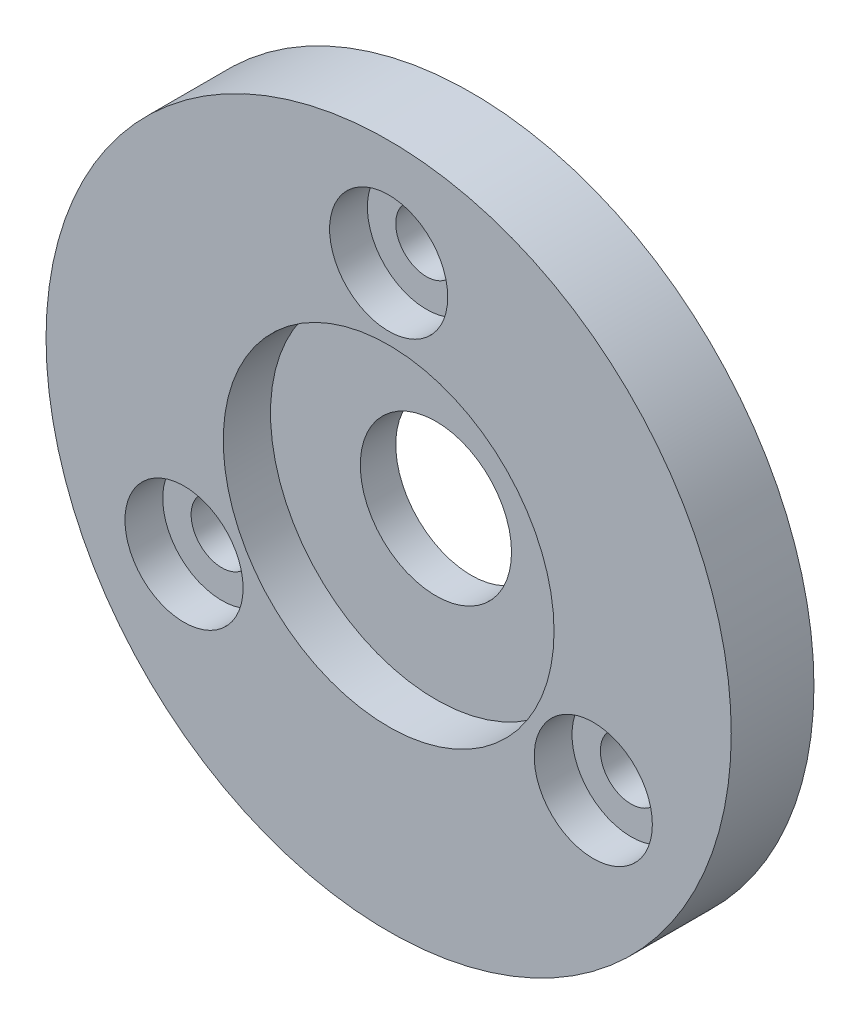
ISO-10303-21;
HEADER;
FILE_DESCRIPTION(('STEP AP214'),'2;1');
FILE_NAME('part.step','',(''),(''),'','','');
FILE_SCHEMA(('AUTOMOTIVE_DESIGN { 1 0 10303 214 1 1 1 1 }'));
ENDSEC;
DATA;
#1=APPLICATION_CONTEXT('core data for automotive mechanical design processes');
#2=APPLICATION_PROTOCOL_DEFINITION('international standard','automotive_design',2000,#1);
#3=PRODUCT_CONTEXT('',#1,'mechanical');
#4=PRODUCT('Part','Part','',(#3));
#5=PRODUCT_RELATED_PRODUCT_CATEGORY('part','',(#4));
#6=PRODUCT_DEFINITION_FORMATION('','',#4);
#7=PRODUCT_DEFINITION_CONTEXT('part definition',#1,'design');
#8=PRODUCT_DEFINITION('design','',#6,#7);
#9=PRODUCT_DEFINITION_SHAPE('','',#8);
#10=(LENGTH_UNIT() NAMED_UNIT(*) SI_UNIT(.MILLI.,.METRE.));
#11=(NAMED_UNIT(*) PLANE_ANGLE_UNIT() SI_UNIT($,.RADIAN.));
#12=(NAMED_UNIT(*) SI_UNIT($,.STERADIAN.) SOLID_ANGLE_UNIT());
#13=UNCERTAINTY_MEASURE_WITH_UNIT(LENGTH_MEASURE(1.E-05),#10,'distance_accuracy_value','');
#14=(GEOMETRIC_REPRESENTATION_CONTEXT(3) GLOBAL_UNCERTAINTY_ASSIGNED_CONTEXT((#13)) GLOBAL_UNIT_ASSIGNED_CONTEXT((#10,
#11,#12)) REPRESENTATION_CONTEXT('',''));
#15=CARTESIAN_POINT('',(0.,0.,0.));
#16=DIRECTION('',(0.,0.,1.));
#17=DIRECTION('',(1.,0.,0.));
#18=AXIS2_PLACEMENT_3D('',#15,#16,#17);
#19=CARTESIAN_POINT('',(0.,0.,0.));
#20=DIRECTION('',(0.,0.,1.));
#21=DIRECTION('',(1.,0.,0.));
#22=AXIS2_PLACEMENT_3D('',#19,#20,#21);
#23=CYLINDRICAL_SURFACE('',#22,3.2);
#24=CARTESIAN_POINT('',(0.,0.,0.));
#25=DIRECTION('',(0.,0.,1.));
#26=DIRECTION('',(1.,0.,0.));
#27=AXIS2_PLACEMENT_3D('',#24,#25,#26);
#28=CIRCLE('',#27,3.2);
#29=CARTESIAN_POINT('',(3.2,0.,0.));
#30=VERTEX_POINT('',#29);
#31=EDGE_CURVE('E44',#30,#30,#28,.T.);
#32=ORIENTED_EDGE('',*,*,#31,.F.);
#33=EDGE_LOOP('',(#32));
#34=FACE_BOUND('',#33,.T.);
#35=CARTESIAN_POINT('',(0.,0.,1.5));
#36=DIRECTION('',(0.,0.,1.));
#37=DIRECTION('',(1.,0.,0.));
#38=AXIS2_PLACEMENT_3D('',#35,#36,#37);
#39=CIRCLE('',#38,3.2);
#40=CARTESIAN_POINT('',(3.2,0.,1.5));
#41=VERTEX_POINT('',#40);
#42=EDGE_CURVE('E35',#41,#41,#39,.F.);
#43=ORIENTED_EDGE('',*,*,#42,.F.);
#44=EDGE_LOOP('',(#43));
#45=FACE_BOUND('',#44,.T.);
#46=ADVANCED_FACE('F31',(#34,#45),#23,.F.);
#47=CARTESIAN_POINT('',(0.,0.,3.5));
#48=DIRECTION('',(0.,0.,-1.));
#49=DIRECTION('',(-1.,0.,0.));
#50=AXIS2_PLACEMENT_3D('',#47,#48,#49);
#51=CYLINDRICAL_SURFACE('',#50,14.5);
#52=CARTESIAN_POINT('',(0.,0.,3.5));
#53=DIRECTION('',(0.,0.,1.));
#54=DIRECTION('',(1.,0.,0.));
#55=AXIS2_PLACEMENT_3D('',#52,#53,#54);
#56=CIRCLE('',#55,14.5);
#57=CARTESIAN_POINT('',(14.5,0.,3.5));
#58=VERTEX_POINT('',#57);
#59=EDGE_CURVE('E10',#58,#58,#56,.T.);
#60=ORIENTED_EDGE('',*,*,#59,.F.);
#61=EDGE_LOOP('',(#60));
#62=FACE_BOUND('',#61,.T.);
#63=CARTESIAN_POINT('',(0.,0.,0.));
#64=DIRECTION('',(0.,0.,1.));
#65=DIRECTION('',(1.,0.,0.));
#66=AXIS2_PLACEMENT_3D('',#63,#64,#65);
#67=CIRCLE('',#66,14.5);
#68=CARTESIAN_POINT('',(14.5,0.,0.));
#69=VERTEX_POINT('',#68);
#70=EDGE_CURVE('E39',#69,#69,#67,.T.);
#71=ORIENTED_EDGE('',*,*,#70,.T.);
#72=EDGE_LOOP('',(#71));
#73=FACE_BOUND('',#72,.T.);
#74=ADVANCED_FACE('F33',(#62,#73),#51,.T.);
#75=CARTESIAN_POINT('',(0.,0.,3.5));
#76=DIRECTION('',(0.,0.,1.));
#77=DIRECTION('',(1.,0.,0.));
#78=AXIS2_PLACEMENT_3D('',#75,#76,#77);
#79=PLANE('',#78);
#80=CARTESIAN_POINT('',(0.,0.,3.5));
#81=DIRECTION('',(0.,0.,1.));
#82=DIRECTION('',(1.,0.,0.));
#83=AXIS2_PLACEMENT_3D('',#80,#81,#82);
#84=CIRCLE('',#83,7.);
#85=CARTESIAN_POINT('',(7.,0.,3.5));
#86=VERTEX_POINT('',#85);
#87=EDGE_CURVE('E163',#86,#86,#84,.T.);
#88=ORIENTED_EDGE('',*,*,#87,.F.);
#89=EDGE_LOOP('',(#88));
#90=FACE_BOUND('',#89,.T.);
#91=CARTESIAN_POINT('',(0.,10.,3.5));
#92=DIRECTION('',(0.,0.,1.));
#93=DIRECTION('',(1.,0.,0.));
#94=AXIS2_PLACEMENT_3D('',#91,#92,#93);
#95=CIRCLE('',#94,2.5);
#96=CARTESIAN_POINT('',(2.5,10.,3.5));
#97=VERTEX_POINT('',#96);
#98=EDGE_CURVE('E72',#97,#97,#95,.T.);
#99=ORIENTED_EDGE('',*,*,#98,.F.);
#100=EDGE_LOOP('',(#99));
#101=FACE_BOUND('',#100,.T.);
#102=CARTESIAN_POINT('',(-8.6602540378444,-4.99999999999998,3.5));
#103=DIRECTION('',(0.,0.,1.));
#104=DIRECTION('',(1.,0.,0.));
#105=AXIS2_PLACEMENT_3D('',#102,#103,#104);
#106=CIRCLE('',#105,2.5);
#107=CARTESIAN_POINT('',(-6.1602540378444,-4.99999999999998,3.5));
#108=VERTEX_POINT('',#107);
#109=EDGE_CURVE('E59',#108,#108,#106,.T.);
#110=ORIENTED_EDGE('',*,*,#109,.F.);
#111=EDGE_LOOP('',(#110));
#112=FACE_BOUND('',#111,.T.);
#113=CARTESIAN_POINT('',(8.6602540378444,-4.99999999999998,3.5));
#114=DIRECTION('',(0.,0.,1.));
#115=DIRECTION('',(1.,0.,0.));
#116=AXIS2_PLACEMENT_3D('',#113,#114,#115);
#117=CIRCLE('',#116,2.5);
#118=CARTESIAN_POINT('',(11.1602540378444,-4.99999999999998,3.5));
#119=VERTEX_POINT('',#118);
#120=EDGE_CURVE('E55',#119,#119,#117,.T.);
#121=ORIENTED_EDGE('',*,*,#120,.F.);
#122=EDGE_LOOP('',(#121));
#123=FACE_BOUND('',#122,.T.);
#124=ORIENTED_EDGE('',*,*,#59,.T.);
#125=EDGE_LOOP('',(#124));
#126=FACE_BOUND('',#125,.T.);
#127=ADVANCED_FACE('F103',(#90,#101,#112,#123,#126),#79,.T.);
#128=CARTESIAN_POINT('',(0.,0.,0.));
#129=DIRECTION('',(0.,0.,1.));
#130=DIRECTION('',(1.,0.,0.));
#131=AXIS2_PLACEMENT_3D('',#128,#129,#130);
#132=PLANE('',#131);
#133=CARTESIAN_POINT('',(0.,10.,0.));
#134=DIRECTION('',(0.,0.,1.));
#135=DIRECTION('',(1.,0.,0.));
#136=AXIS2_PLACEMENT_3D('',#133,#134,#135);
#137=CIRCLE('',#136,1.3);
#138=CARTESIAN_POINT('',(1.3,10.,0.));
#139=VERTEX_POINT('',#138);
#140=EDGE_CURVE('E57',#139,#139,#137,.T.);
#141=ORIENTED_EDGE('',*,*,#140,.T.);
#142=EDGE_LOOP('',(#141));
#143=FACE_BOUND('',#142,.T.);
#144=CARTESIAN_POINT('',(-8.6602540378444,-4.99999999999998,0.));
#145=DIRECTION('',(0.,0.,1.));
#146=DIRECTION('',(1.,0.,0.));
#147=AXIS2_PLACEMENT_3D('',#144,#145,#146);
#148=CIRCLE('',#147,1.3);
#149=CARTESIAN_POINT('',(-7.3602540378444,-4.99999999999998,0.));
#150=VERTEX_POINT('',#149);
#151=EDGE_CURVE('E53',#150,#150,#148,.T.);
#152=ORIENTED_EDGE('',*,*,#151,.T.);
#153=EDGE_LOOP('',(#152));
#154=FACE_BOUND('',#153,.T.);
#155=CARTESIAN_POINT('',(8.6602540378444,-4.99999999999998,0.));
#156=DIRECTION('',(0.,0.,1.));
#157=DIRECTION('',(1.,0.,0.));
#158=AXIS2_PLACEMENT_3D('',#155,#156,#157);
#159=CIRCLE('',#158,1.3);
#160=CARTESIAN_POINT('',(9.9602540378444,-4.99999999999998,0.));
#161=VERTEX_POINT('',#160);
#162=EDGE_CURVE('E49',#161,#161,#159,.T.);
#163=ORIENTED_EDGE('',*,*,#162,.T.);
#164=EDGE_LOOP('',(#163));
#165=FACE_BOUND('',#164,.T.);
#166=ORIENTED_EDGE('',*,*,#31,.T.);
#167=EDGE_LOOP('',(#166));
#168=FACE_BOUND('',#167,.T.);
#169=ORIENTED_EDGE('',*,*,#70,.F.);
#170=EDGE_LOOP('',(#169));
#171=FACE_BOUND('',#170,.T.);
#172=ADVANCED_FACE('F105',(#143,#154,#165,#168,#171),#132,.F.);
#173=CARTESIAN_POINT('',(8.6602540378444,-4.99999999999998,3.5));
#174=DIRECTION('',(0.,0.,1.));
#175=DIRECTION('',(1.,0.,0.));
#176=AXIS2_PLACEMENT_3D('',#173,#174,#175);
#177=CYLINDRICAL_SURFACE('',#176,1.3);
#178=CARTESIAN_POINT('',(8.6602540378444,-4.99999999999998,1.9));
#179=DIRECTION('',(0.,0.,1.));
#180=DIRECTION('',(1.,0.,0.));
#181=AXIS2_PLACEMENT_3D('',#178,#179,#180);
#182=CIRCLE('',#181,1.3);
#183=CARTESIAN_POINT('',(9.9602540378444,-4.99999999999998,1.9));
#184=VERTEX_POINT('',#183);
#185=EDGE_CURVE('E52',#184,#184,#182,.T.);
#186=ORIENTED_EDGE('',*,*,#185,.T.);
#187=EDGE_LOOP('',(#186));
#188=FACE_BOUND('',#187,.T.);
#189=ORIENTED_EDGE('',*,*,#162,.F.);
#190=EDGE_LOOP('',(#189));
#191=FACE_BOUND('',#190,.T.);
#192=ADVANCED_FACE('F87',(#188,#191),#177,.F.);
#193=CARTESIAN_POINT('',(9.9602540378444,-4.99999999999998,1.9));
#194=DIRECTION('',(0.,0.,-1.));
#195=DIRECTION('',(-1.,0.,0.));
#196=AXIS2_PLACEMENT_3D('',#193,#194,#195);
#197=PLANE('',#196);
#198=ORIENTED_EDGE('',*,*,#185,.F.);
#199=EDGE_LOOP('',(#198));
#200=FACE_BOUND('',#199,.T.);
#201=CARTESIAN_POINT('',(8.6602540378444,-4.99999999999998,1.9));
#202=DIRECTION('',(0.,0.,1.));
#203=DIRECTION('',(1.,0.,0.));
#204=AXIS2_PLACEMENT_3D('',#201,#202,#203);
#205=CIRCLE('',#204,2.5);
#206=CARTESIAN_POINT('',(11.1602540378444,-4.99999999999998,1.9));
#207=VERTEX_POINT('',#206);
#208=EDGE_CURVE('E82',#207,#207,#205,.T.);
#209=ORIENTED_EDGE('',*,*,#208,.T.);
#210=EDGE_LOOP('',(#209));
#211=FACE_BOUND('',#210,.T.);
#212=ADVANCED_FACE('F90',(#200,#211),#197,.F.);
#213=CARTESIAN_POINT('',(8.6602540378444,-4.99999999999998,3.5));
#214=DIRECTION('',(0.,0.,1.));
#215=DIRECTION('',(1.,0.,0.));
#216=AXIS2_PLACEMENT_3D('',#213,#214,#215);
#217=CYLINDRICAL_SURFACE('',#216,2.5);
#218=ORIENTED_EDGE('',*,*,#208,.F.);
#219=EDGE_LOOP('',(#218));
#220=FACE_BOUND('',#219,.T.);
#221=ORIENTED_EDGE('',*,*,#120,.T.);
#222=EDGE_LOOP('',(#221));
#223=FACE_BOUND('',#222,.T.);
#224=ADVANCED_FACE('F93',(#220,#223),#217,.F.);
#225=CARTESIAN_POINT('',(-8.6602540378444,-4.99999999999998,3.5));
#226=DIRECTION('',(0.,0.,1.));
#227=DIRECTION('',(1.,0.,0.));
#228=AXIS2_PLACEMENT_3D('',#225,#226,#227);
#229=CYLINDRICAL_SURFACE('',#228,1.3);
#230=CARTESIAN_POINT('',(-8.6602540378444,-4.99999999999998,1.9));
#231=DIRECTION('',(0.,0.,1.));
#232=DIRECTION('',(1.,0.,0.));
#233=AXIS2_PLACEMENT_3D('',#230,#231,#232);
#234=CIRCLE('',#233,1.3);
#235=CARTESIAN_POINT('',(-7.3602540378444,-4.99999999999998,1.9));
#236=VERTEX_POINT('',#235);
#237=EDGE_CURVE('E56',#236,#236,#234,.T.);
#238=ORIENTED_EDGE('',*,*,#237,.T.);
#239=EDGE_LOOP('',(#238));
#240=FACE_BOUND('',#239,.T.);
#241=ORIENTED_EDGE('',*,*,#151,.F.);
#242=EDGE_LOOP('',(#241));
#243=FACE_BOUND('',#242,.T.);
#244=ADVANCED_FACE('F99',(#240,#243),#229,.F.);
#245=CARTESIAN_POINT('',(-7.3602540378444,-4.99999999999998,1.9));
#246=DIRECTION('',(0.,0.,-1.));
#247=DIRECTION('',(-1.,0.,0.));
#248=AXIS2_PLACEMENT_3D('',#245,#246,#247);
#249=PLANE('',#248);
#250=ORIENTED_EDGE('',*,*,#237,.F.);
#251=EDGE_LOOP('',(#250));
#252=FACE_BOUND('',#251,.T.);
#253=CARTESIAN_POINT('',(-8.6602540378444,-4.99999999999998,1.9));
#254=DIRECTION('',(0.,0.,1.));
#255=DIRECTION('',(1.,0.,0.));
#256=AXIS2_PLACEMENT_3D('',#253,#254,#255);
#257=CIRCLE('',#256,2.5);
#258=CARTESIAN_POINT('',(-6.1602540378444,-4.99999999999998,1.9));
#259=VERTEX_POINT('',#258);
#260=EDGE_CURVE('E64',#259,#259,#257,.T.);
#261=ORIENTED_EDGE('',*,*,#260,.T.);
#262=EDGE_LOOP('',(#261));
#263=FACE_BOUND('',#262,.T.);
#264=ADVANCED_FACE('F127',(#252,#263),#249,.F.);
#265=CARTESIAN_POINT('',(-8.6602540378444,-4.99999999999998,3.5));
#266=DIRECTION('',(0.,0.,1.));
#267=DIRECTION('',(1.,0.,0.));
#268=AXIS2_PLACEMENT_3D('',#265,#266,#267);
#269=CYLINDRICAL_SURFACE('',#268,2.5);
#270=ORIENTED_EDGE('',*,*,#260,.F.);
#271=EDGE_LOOP('',(#270));
#272=FACE_BOUND('',#271,.T.);
#273=ORIENTED_EDGE('',*,*,#109,.T.);
#274=EDGE_LOOP('',(#273));
#275=FACE_BOUND('',#274,.T.);
#276=ADVANCED_FACE('F131',(#272,#275),#269,.F.);
#277=CARTESIAN_POINT('',(0.,10.,3.5));
#278=DIRECTION('',(0.,0.,1.));
#279=DIRECTION('',(1.,0.,0.));
#280=AXIS2_PLACEMENT_3D('',#277,#278,#279);
#281=CYLINDRICAL_SURFACE('',#280,1.3);
#282=CARTESIAN_POINT('',(0.,10.,1.9));
#283=DIRECTION('',(0.,0.,1.));
#284=DIRECTION('',(1.,0.,0.));
#285=AXIS2_PLACEMENT_3D('',#282,#283,#284);
#286=CIRCLE('',#285,1.3);
#287=CARTESIAN_POINT('',(1.3,10.,1.9));
#288=VERTEX_POINT('',#287);
#289=EDGE_CURVE('E60',#288,#288,#286,.T.);
#290=ORIENTED_EDGE('',*,*,#289,.T.);
#291=EDGE_LOOP('',(#290));
#292=FACE_BOUND('',#291,.T.);
#293=ORIENTED_EDGE('',*,*,#140,.F.);
#294=EDGE_LOOP('',(#293));
#295=FACE_BOUND('',#294,.T.);
#296=ADVANCED_FACE('F135',(#292,#295),#281,.F.);
#297=CARTESIAN_POINT('',(1.3,10.,1.9));
#298=DIRECTION('',(0.,0.,-1.));
#299=DIRECTION('',(-1.,0.,0.));
#300=AXIS2_PLACEMENT_3D('',#297,#298,#299);
#301=PLANE('',#300);
#302=ORIENTED_EDGE('',*,*,#289,.F.);
#303=EDGE_LOOP('',(#302));
#304=FACE_BOUND('',#303,.T.);
#305=CARTESIAN_POINT('',(0.,10.,1.9));
#306=DIRECTION('',(0.,0.,1.));
#307=DIRECTION('',(1.,0.,0.));
#308=AXIS2_PLACEMENT_3D('',#305,#306,#307);
#309=CIRCLE('',#308,2.5);
#310=CARTESIAN_POINT('',(2.5,10.,1.9));
#311=VERTEX_POINT('',#310);
#312=EDGE_CURVE('E67',#311,#311,#309,.T.);
#313=ORIENTED_EDGE('',*,*,#312,.T.);
#314=EDGE_LOOP('',(#313));
#315=FACE_BOUND('',#314,.T.);
#316=ADVANCED_FACE('F139',(#304,#315),#301,.F.);
#317=CARTESIAN_POINT('',(0.,10.,3.5));
#318=DIRECTION('',(0.,0.,1.));
#319=DIRECTION('',(1.,0.,0.));
#320=AXIS2_PLACEMENT_3D('',#317,#318,#319);
#321=CYLINDRICAL_SURFACE('',#320,2.5);
#322=ORIENTED_EDGE('',*,*,#312,.F.);
#323=EDGE_LOOP('',(#322));
#324=FACE_BOUND('',#323,.T.);
#325=ORIENTED_EDGE('',*,*,#98,.T.);
#326=EDGE_LOOP('',(#325));
#327=FACE_BOUND('',#326,.T.);
#328=ADVANCED_FACE('F142',(#324,#327),#321,.F.);
#329=CARTESIAN_POINT('',(0.,0.,1.5));
#330=DIRECTION('',(0.,0.,1.));
#331=DIRECTION('',(1.,0.,0.));
#332=AXIS2_PLACEMENT_3D('',#329,#330,#331);
#333=PLANE('',#332);
#334=CARTESIAN_POINT('',(0.,0.,1.5));
#335=DIRECTION('',(0.,0.,1.));
#336=DIRECTION('',(1.,0.,0.));
#337=AXIS2_PLACEMENT_3D('',#334,#335,#336);
#338=CIRCLE('',#337,7.);
#339=CARTESIAN_POINT('',(7.,0.,1.5));
#340=VERTEX_POINT('',#339);
#341=EDGE_CURVE('E159',#340,#340,#338,.T.);
#342=ORIENTED_EDGE('',*,*,#341,.T.);
#343=EDGE_LOOP('',(#342));
#344=FACE_BOUND('',#343,.T.);
#345=ORIENTED_EDGE('',*,*,#42,.T.);
#346=EDGE_LOOP('',(#345));
#347=FACE_BOUND('',#346,.T.);
#348=ADVANCED_FACE('F146',(#344,#347),#333,.T.);
#349=CARTESIAN_POINT('',(0.,0.,1.5));
#350=DIRECTION('',(0.,0.,1.));
#351=DIRECTION('',(1.,0.,0.));
#352=AXIS2_PLACEMENT_3D('',#349,#350,#351);
#353=CYLINDRICAL_SURFACE('',#352,7.);
#354=ORIENTED_EDGE('',*,*,#341,.F.);
#355=EDGE_LOOP('',(#354));
#356=FACE_BOUND('',#355,.T.);
#357=ORIENTED_EDGE('',*,*,#87,.T.);
#358=EDGE_LOOP('',(#357));
#359=FACE_BOUND('',#358,.T.);
#360=ADVANCED_FACE('F148',(#356,#359),#353,.F.);
#361=CLOSED_SHELL('',(#46,#74,#127,#172,#192,#212,#224,#244,#264,#276,#296,#316,#328,#348,#360));
#362=MANIFOLD_SOLID_BREP('B2',#361);
#363=ADVANCED_BREP_SHAPE_REPRESENTATION('',(#18,#362),#14);
#364=SHAPE_DEFINITION_REPRESENTATION(#9,#363);
ENDSEC;
END-ISO-10303-21;
